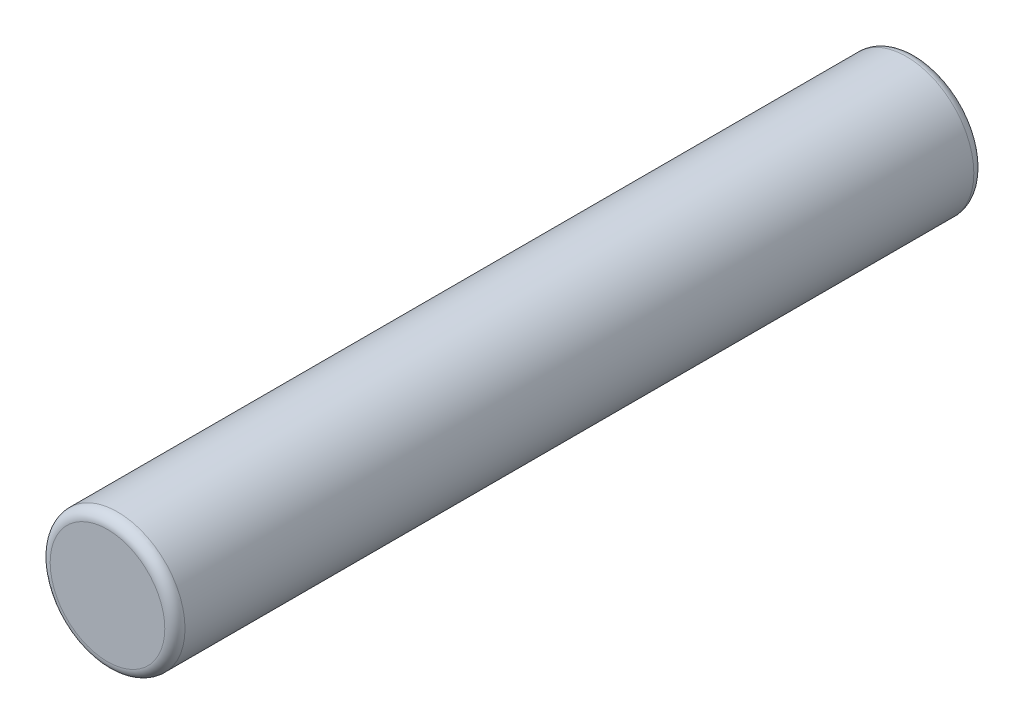
ISO-10303-21;
HEADER;
FILE_DESCRIPTION(('STEP AP214'),'2;1');
FILE_NAME('part.step','',(''),(''),'','','');
FILE_SCHEMA(('AUTOMOTIVE_DESIGN { 1 0 10303 214 1 1 1 1 }'));
ENDSEC;
DATA;
#1=APPLICATION_CONTEXT('core data for automotive mechanical design processes');
#2=APPLICATION_PROTOCOL_DEFINITION('international standard','automotive_design',2000,#1);
#3=PRODUCT_CONTEXT('',#1,'mechanical');
#4=PRODUCT('Part','Part','',(#3));
#5=PRODUCT_RELATED_PRODUCT_CATEGORY('part','',(#4));
#6=PRODUCT_DEFINITION_FORMATION('','',#4);
#7=PRODUCT_DEFINITION_CONTEXT('part definition',#1,'design');
#8=PRODUCT_DEFINITION('design','',#6,#7);
#9=PRODUCT_DEFINITION_SHAPE('','',#8);
#10=(LENGTH_UNIT() NAMED_UNIT(*) SI_UNIT(.MILLI.,.METRE.));
#11=(NAMED_UNIT(*) PLANE_ANGLE_UNIT() SI_UNIT($,.RADIAN.));
#12=(NAMED_UNIT(*) SI_UNIT($,.STERADIAN.) SOLID_ANGLE_UNIT());
#13=UNCERTAINTY_MEASURE_WITH_UNIT(LENGTH_MEASURE(1.E-05),#10,'distance_accuracy_value','');
#14=(GEOMETRIC_REPRESENTATION_CONTEXT(3) GLOBAL_UNCERTAINTY_ASSIGNED_CONTEXT((#13)) GLOBAL_UNIT_ASSIGNED_CONTEXT((#10,
#11,#12)) REPRESENTATION_CONTEXT('',''));
#15=CARTESIAN_POINT('',(0.,0.,0.));
#16=DIRECTION('',(0.,0.,1.));
#17=DIRECTION('',(1.,0.,0.));
#18=AXIS2_PLACEMENT_3D('',#15,#16,#17);
#19=CARTESIAN_POINT('',(0.,0.,23.9999999999999));
#20=DIRECTION('',(0.,0.,1.));
#21=DIRECTION('',(1.,0.,0.));
#22=AXIS2_PLACEMENT_3D('',#19,#20,#21);
#23=PLANE('',#22);
#24=CARTESIAN_POINT('',(0.,0.,23.9999999999999));
#25=DIRECTION('',(0.,0.,-1.));
#26=DIRECTION('',(0.,-1.,0.));
#27=AXIS2_PLACEMENT_3D('',#24,#25,#26);
#28=CIRCLE('',#27,1.69999999999998);
#29=CARTESIAN_POINT('',(0.,-1.69999999999998,23.9999999999999));
#30=VERTEX_POINT('',#29);
#31=CARTESIAN_POINT('',(0.,1.69999999999998,23.9999999999999));
#32=VERTEX_POINT('',#31);
#33=EDGE_CURVE('E51',#30,#32,#28,.T.);
#34=ORIENTED_EDGE('',*,*,#33,.F.);
#35=CARTESIAN_POINT('',(0.,0.,23.9999999999999));
#36=DIRECTION('',(0.,0.,-1.));
#37=DIRECTION('',(0.,1.,0.));
#38=AXIS2_PLACEMENT_3D('',#35,#36,#37);
#39=CIRCLE('',#38,1.69999999999998);
#40=EDGE_CURVE('E55',#32,#30,#39,.T.);
#41=ORIENTED_EDGE('',*,*,#40,.F.);
#42=EDGE_LOOP('',(#34,#41));
#43=FACE_BOUND('',#42,.T.);
#44=ADVANCED_FACE('F16',(#43),#23,.T.);
#45=CARTESIAN_POINT('',(0.,0.,0.));
#46=DIRECTION('',(0.,0.,1.));
#47=DIRECTION('',(1.,0.,0.));
#48=AXIS2_PLACEMENT_3D('',#45,#46,#47);
#49=PLANE('',#48);
#50=CARTESIAN_POINT('',(0.,0.,0.));
#51=DIRECTION('',(0.,0.,1.));
#52=DIRECTION('',(0.,1.,0.));
#53=AXIS2_PLACEMENT_3D('',#50,#51,#52);
#54=CIRCLE('',#53,1.69999999999999);
#55=CARTESIAN_POINT('',(0.,1.69999999999999,0.));
#56=VERTEX_POINT('',#55);
#57=CARTESIAN_POINT('',(0.,-1.69999999999999,0.));
#58=VERTEX_POINT('',#57);
#59=EDGE_CURVE('E35',#56,#58,#54,.T.);
#60=ORIENTED_EDGE('',*,*,#59,.F.);
#61=CARTESIAN_POINT('',(0.,0.,0.));
#62=DIRECTION('',(0.,0.,1.));
#63=DIRECTION('',(0.,-1.,0.));
#64=AXIS2_PLACEMENT_3D('',#61,#62,#63);
#65=CIRCLE('',#64,1.69999999999999);
#66=EDGE_CURVE('E39',#58,#56,#65,.T.);
#67=ORIENTED_EDGE('',*,*,#66,.F.);
#68=EDGE_LOOP('',(#60,#67));
#69=FACE_BOUND('',#68,.T.);
#70=ADVANCED_FACE('F88',(#69),#49,.F.);
#71=CARTESIAN_POINT('',(0.,0.,23.6999999999999));
#72=DIRECTION('',(0.,0.,1.));
#73=DIRECTION('',(0.,-1.,0.));
#74=AXIS2_PLACEMENT_3D('',#71,#72,#73);
#75=TOROIDAL_SURFACE('',#74,1.69999999999998,0.300000000000005);
#76=ORIENTED_EDGE('',*,*,#33,.T.);
#77=ORIENTED_EDGE('',*,*,#40,.T.);
#78=EDGE_LOOP('',(#76,#77));
#79=FACE_BOUND('',#78,.T.);
#80=CARTESIAN_POINT('',(0.,0.,23.6999999999999));
#81=DIRECTION('',(0.,0.,1.));
#82=DIRECTION('',(1.,0.,0.));
#83=AXIS2_PLACEMENT_3D('',#80,#81,#82);
#84=CIRCLE('',#83,2.);
#85=CARTESIAN_POINT('',(2.,0.,23.6999999999999));
#86=VERTEX_POINT('',#85);
#87=EDGE_CURVE('E11',#86,#86,#84,.F.);
#88=ORIENTED_EDGE('',*,*,#87,.F.);
#89=EDGE_LOOP('',(#88));
#90=FACE_BOUND('',#89,.T.);
#91=ADVANCED_FACE('F53',(#79,#90),#75,.T.);
#92=CARTESIAN_POINT('',(0.,0.,0.299999999999999));
#93=DIRECTION('',(0.,0.,1.));
#94=DIRECTION('',(0.,-1.,0.));
#95=AXIS2_PLACEMENT_3D('',#92,#93,#94);
#96=TOROIDAL_SURFACE('',#95,1.69999999999999,0.3);
#97=CARTESIAN_POINT('',(0.,0.,0.299999999999998));
#98=DIRECTION('',(0.,0.,1.));
#99=DIRECTION('',(1.,0.,0.));
#100=AXIS2_PLACEMENT_3D('',#97,#98,#99);
#101=CIRCLE('',#100,2.);
#102=CARTESIAN_POINT('',(2.,0.,0.299999999999998));
#103=VERTEX_POINT('',#102);
#104=EDGE_CURVE('E28',#103,#103,#101,.T.);
#105=ORIENTED_EDGE('',*,*,#104,.F.);
#106=EDGE_LOOP('',(#105));
#107=FACE_BOUND('',#106,.T.);
#108=ORIENTED_EDGE('',*,*,#66,.T.);
#109=ORIENTED_EDGE('',*,*,#59,.T.);
#110=EDGE_LOOP('',(#108,#109));
#111=FACE_BOUND('',#110,.T.);
#112=ADVANCED_FACE('F87',(#107,#111),#96,.T.);
#113=CARTESIAN_POINT('',(0.,0.,0.));
#114=DIRECTION('',(0.,0.,1.));
#115=DIRECTION('',(1.,0.,0.));
#116=AXIS2_PLACEMENT_3D('',#113,#114,#115);
#117=CYLINDRICAL_SURFACE('',#116,2.);
#118=ORIENTED_EDGE('',*,*,#87,.T.);
#119=EDGE_LOOP('',(#118));
#120=FACE_BOUND('',#119,.T.);
#121=ORIENTED_EDGE('',*,*,#104,.T.);
#122=EDGE_LOOP('',(#121));
#123=FACE_BOUND('',#122,.T.);
#124=ADVANCED_FACE('F127',(#120,#123),#117,.T.);
#125=CLOSED_SHELL('',(#44,#70,#91,#112,#124));
#126=MANIFOLD_SOLID_BREP('B1',#125);
#127=ADVANCED_BREP_SHAPE_REPRESENTATION('',(#18,#126),#14);
#128=SHAPE_DEFINITION_REPRESENTATION(#9,#127);
ENDSEC;
END-ISO-10303-21;
